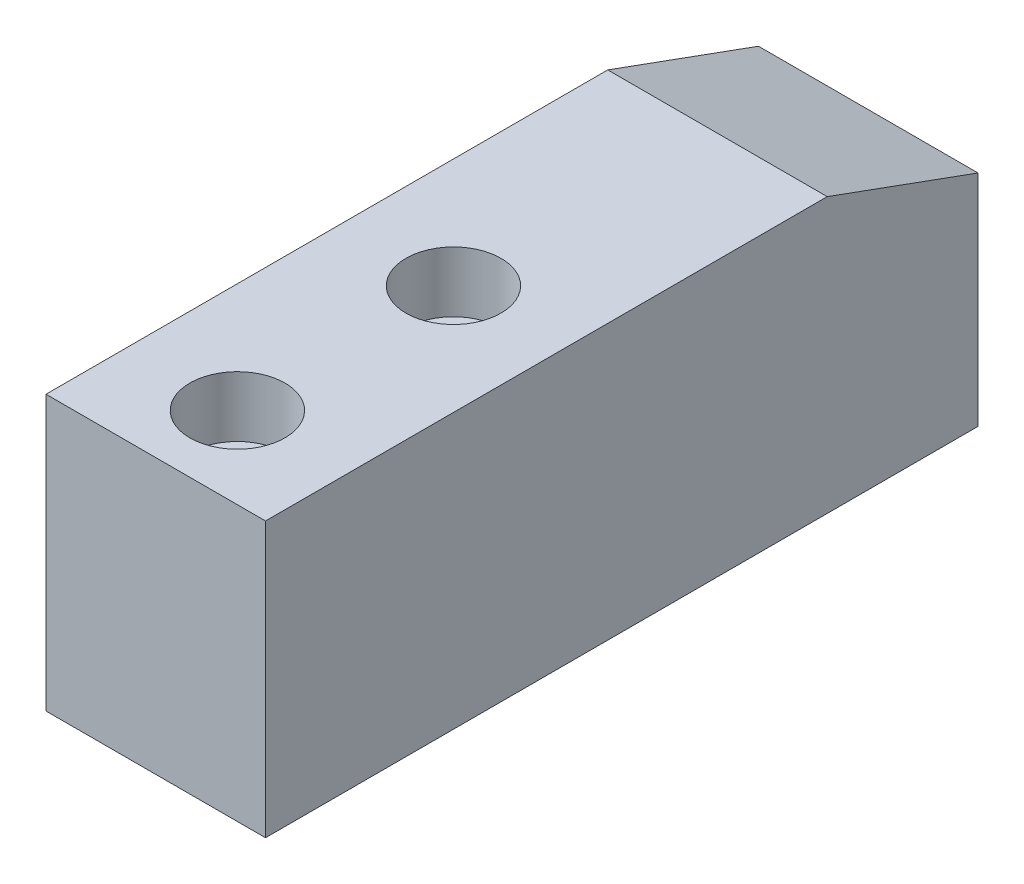
ISO-10303-21;
HEADER;
FILE_DESCRIPTION(('STEP AP214'),'2;1');
FILE_NAME('part.step','',(''),(''),'','','');
FILE_SCHEMA(('AUTOMOTIVE_DESIGN { 1 0 10303 214 1 1 1 1 }'));
ENDSEC;
DATA;
#1=APPLICATION_CONTEXT('core data for automotive mechanical design processes');
#2=APPLICATION_PROTOCOL_DEFINITION('international standard','automotive_design',2000,#1);
#3=PRODUCT_CONTEXT('',#1,'mechanical');
#4=PRODUCT('Part','Part','',(#3));
#5=PRODUCT_RELATED_PRODUCT_CATEGORY('part','',(#4));
#6=PRODUCT_DEFINITION_FORMATION('','',#4);
#7=PRODUCT_DEFINITION_CONTEXT('part definition',#1,'design');
#8=PRODUCT_DEFINITION('design','',#6,#7);
#9=PRODUCT_DEFINITION_SHAPE('','',#8);
#10=(LENGTH_UNIT() NAMED_UNIT(*) SI_UNIT(.MILLI.,.METRE.));
#11=(NAMED_UNIT(*) PLANE_ANGLE_UNIT() SI_UNIT($,.RADIAN.));
#12=(NAMED_UNIT(*) SI_UNIT($,.STERADIAN.) SOLID_ANGLE_UNIT());
#13=UNCERTAINTY_MEASURE_WITH_UNIT(LENGTH_MEASURE(1.E-05),#10,'distance_accuracy_value','');
#14=(GEOMETRIC_REPRESENTATION_CONTEXT(3) GLOBAL_UNCERTAINTY_ASSIGNED_CONTEXT((#13)) GLOBAL_UNIT_ASSIGNED_CONTEXT((#10,
#11,#12)) REPRESENTATION_CONTEXT('',''));
#15=CARTESIAN_POINT('',(0.,0.,0.));
#16=DIRECTION('',(0.,0.,1.));
#17=DIRECTION('',(1.,0.,0.));
#18=AXIS2_PLACEMENT_3D('',#15,#16,#17);
#19=CARTESIAN_POINT('',(12.7,31.75,0.));
#20=DIRECTION('',(0.,0.,-1.));
#21=DIRECTION('',(0.,1.,0.));
#22=AXIS2_PLACEMENT_3D('',#19,#20,#21);
#23=PLANE('',#22);
#24=DIRECTION('',(0.,-1.,0.));
#25=VECTOR('',#24,1.);
#26=CARTESIAN_POINT('',(-12.7,31.75,0.));
#27=LINE('',#26,#25);
#28=CARTESIAN_POINT('',(-12.7,31.75,0.));
#29=VERTEX_POINT('',#28);
#30=CARTESIAN_POINT('',(-12.7,0.,0.));
#31=VERTEX_POINT('',#30);
#32=EDGE_CURVE('E108',#29,#31,#27,.T.);
#33=ORIENTED_EDGE('',*,*,#32,.T.);
#34=DIRECTION('',(-1.,0.,0.));
#35=VECTOR('',#34,1.);
#36=CARTESIAN_POINT('',(12.7,0.,0.));
#37=LINE('',#36,#35);
#38=CARTESIAN_POINT('',(12.7,0.,0.));
#39=VERTEX_POINT('',#38);
#40=EDGE_CURVE('E11',#39,#31,#37,.T.);
#41=ORIENTED_EDGE('',*,*,#40,.F.);
#42=DIRECTION('',(0.,-1.,0.));
#43=VECTOR('',#42,1.);
#44=CARTESIAN_POINT('',(12.7,31.75,0.));
#45=LINE('',#44,#43);
#46=CARTESIAN_POINT('',(12.7,31.75,0.));
#47=VERTEX_POINT('',#46);
#48=EDGE_CURVE('E117',#47,#39,#45,.T.);
#49=ORIENTED_EDGE('',*,*,#48,.F.);
#50=DIRECTION('',(-1.,0.,0.));
#51=VECTOR('',#50,1.);
#52=CARTESIAN_POINT('',(12.7,31.75,0.));
#53=LINE('',#52,#51);
#54=EDGE_CURVE('E104',#47,#29,#53,.T.);
#55=ORIENTED_EDGE('',*,*,#54,.T.);
#56=EDGE_LOOP('',(#33,#41,#49,#55));
#57=FACE_BOUND('',#56,.T.);
#58=ADVANCED_FACE('F34',(#57),#23,.F.);
#59=CARTESIAN_POINT('',(12.7,0.,0.));
#60=DIRECTION('',(0.,1.,0.));
#61=DIRECTION('',(0.,0.,1.));
#62=AXIS2_PLACEMENT_3D('',#59,#60,#61);
#63=PLANE('',#62);
#64=CARTESIAN_POINT('',(0.,0.,-9.44648161353717));
#65=DIRECTION('',(0.,1.,0.));
#66=DIRECTION('',(0.,0.,1.));
#67=AXIS2_PLACEMENT_3D('',#64,#65,#66);
#68=CIRCLE('',#67,3.29999999999999);
#69=CARTESIAN_POINT('',(0.,0.,-6.14648161353717));
#70=VERTEX_POINT('',#69);
#71=EDGE_CURVE('E151',#70,#70,#68,.T.);
#72=ORIENTED_EDGE('',*,*,#71,.T.);
#73=EDGE_LOOP('',(#72));
#74=FACE_BOUND('',#73,.T.);
#75=CARTESIAN_POINT('',(0.,0.,-34.4464816135372));
#76=DIRECTION('',(0.,1.,0.));
#77=DIRECTION('',(0.,0.,1.));
#78=AXIS2_PLACEMENT_3D('',#75,#76,#77);
#79=CIRCLE('',#78,3.29999999999999);
#80=CARTESIAN_POINT('',(0.,0.,-31.1464816135372));
#81=VERTEX_POINT('',#80);
#82=EDGE_CURVE('E112',#81,#81,#79,.T.);
#83=ORIENTED_EDGE('',*,*,#82,.T.);
#84=EDGE_LOOP('',(#83));
#85=FACE_BOUND('',#84,.T.);
#86=DIRECTION('',(0.,0.,-1.));
#87=VECTOR('',#86,1.);
#88=CARTESIAN_POINT('',(-12.7,0.,0.));
#89=LINE('',#88,#87);
#90=CARTESIAN_POINT('',(-12.7,0.,-82.4464816135372));
#91=VERTEX_POINT('',#90);
#92=EDGE_CURVE('E111',#31,#91,#89,.T.);
#93=ORIENTED_EDGE('',*,*,#92,.T.);
#94=DIRECTION('',(-1.,0.,0.));
#95=VECTOR('',#94,1.);
#96=CARTESIAN_POINT('',(12.7,0.,-82.4464816135372));
#97=LINE('',#96,#95);
#98=CARTESIAN_POINT('',(12.7,0.,-82.4464816135372));
#99=VERTEX_POINT('',#98);
#100=EDGE_CURVE('E42',#99,#91,#97,.T.);
#101=ORIENTED_EDGE('',*,*,#100,.F.);
#102=DIRECTION('',(0.,0.,-1.));
#103=VECTOR('',#102,1.);
#104=CARTESIAN_POINT('',(12.7,0.,0.));
#105=LINE('',#104,#103);
#106=EDGE_CURVE('E84',#39,#99,#105,.T.);
#107=ORIENTED_EDGE('',*,*,#106,.F.);
#108=ORIENTED_EDGE('',*,*,#40,.T.);
#109=EDGE_LOOP('',(#93,#101,#107,#108));
#110=FACE_BOUND('',#109,.T.);
#111=ADVANCED_FACE('F139',(#74,#85,#110),#63,.F.);
#112=CARTESIAN_POINT('',(12.7,0.,-82.4464816135372));
#113=DIRECTION('',(0.,0.,1.));
#114=DIRECTION('',(0.,-1.,0.));
#115=AXIS2_PLACEMENT_3D('',#112,#113,#114);
#116=PLANE('',#115);
#117=DIRECTION('',(0.,1.,0.));
#118=VECTOR('',#117,1.);
#119=CARTESIAN_POINT('',(-12.7,0.,-82.4464816135372));
#120=LINE('',#119,#118);
#121=CARTESIAN_POINT('',(-12.7,25.4,-82.4464816135372));
#122=VERTEX_POINT('',#121);
#123=EDGE_CURVE('E99',#91,#122,#120,.T.);
#124=ORIENTED_EDGE('',*,*,#123,.T.);
#125=DIRECTION('',(-1.,0.,0.));
#126=VECTOR('',#125,1.);
#127=CARTESIAN_POINT('',(12.7,25.4,-82.4464816135372));
#128=LINE('',#127,#126);
#129=CARTESIAN_POINT('',(12.7,25.4,-82.4464816135372));
#130=VERTEX_POINT('',#129);
#131=EDGE_CURVE('E96',#130,#122,#128,.T.);
#132=ORIENTED_EDGE('',*,*,#131,.F.);
#133=DIRECTION('',(0.,1.,0.));
#134=VECTOR('',#133,1.);
#135=CARTESIAN_POINT('',(12.7,0.,-82.4464816135372));
#136=LINE('',#135,#134);
#137=EDGE_CURVE('E88',#99,#130,#136,.T.);
#138=ORIENTED_EDGE('',*,*,#137,.F.);
#139=ORIENTED_EDGE('',*,*,#100,.T.);
#140=EDGE_LOOP('',(#124,#132,#138,#139));
#141=FACE_BOUND('',#140,.T.);
#142=ADVANCED_FACE('F97',(#141),#116,.F.);
#143=CARTESIAN_POINT('',(12.7,25.4,-82.4464816135372));
#144=DIRECTION('',(0.,-0.93969262078591,0.342020143325663));
#145=DIRECTION('',(0.,-0.342020143325663,-0.939692620785911));
#146=AXIS2_PLACEMENT_3D('',#143,#144,#145);
#147=PLANE('',#146);
#148=DIRECTION('',(0.,0.342020143325663,0.93969262078591));
#149=VECTOR('',#148,1.);
#150=CARTESIAN_POINT('',(-12.7,25.4,-82.4464816135372));
#151=LINE('',#150,#149);
#152=CARTESIAN_POINT('',(-12.7,31.75,-65.));
#153=VERTEX_POINT('',#152);
#154=EDGE_CURVE('E70',#122,#153,#151,.T.);
#155=ORIENTED_EDGE('',*,*,#154,.T.);
#156=DIRECTION('',(-1.,0.,0.));
#157=VECTOR('',#156,1.);
#158=CARTESIAN_POINT('',(12.7,31.75,-65.));
#159=LINE('',#158,#157);
#160=CARTESIAN_POINT('',(12.7,31.75,-65.));
#161=VERTEX_POINT('',#160);
#162=EDGE_CURVE('E100',#161,#153,#159,.T.);
#163=ORIENTED_EDGE('',*,*,#162,.F.);
#164=DIRECTION('',(0.,0.342020143325663,0.93969262078591));
#165=VECTOR('',#164,1.);
#166=CARTESIAN_POINT('',(12.7,25.4,-82.4464816135372));
#167=LINE('',#166,#165);
#168=EDGE_CURVE('E92',#130,#161,#167,.T.);
#169=ORIENTED_EDGE('',*,*,#168,.F.);
#170=ORIENTED_EDGE('',*,*,#131,.T.);
#171=EDGE_LOOP('',(#155,#163,#169,#170));
#172=FACE_BOUND('',#171,.T.);
#173=ADVANCED_FACE('F102',(#172),#147,.F.);
#174=CARTESIAN_POINT('',(12.7,31.75,-65.));
#175=DIRECTION('',(0.,-1.,0.));
#176=DIRECTION('',(0.,0.,-1.));
#177=AXIS2_PLACEMENT_3D('',#174,#175,#176);
#178=PLANE('',#177);
#179=CARTESIAN_POINT('',(0.,31.75,-9.44648161353716));
#180=DIRECTION('',(0.,1.,0.));
#181=DIRECTION('',(0.,0.,1.));
#182=AXIS2_PLACEMENT_3D('',#179,#180,#181);
#183=CIRCLE('',#182,5.5);
#184=CARTESIAN_POINT('',(0.,31.75,-3.94648161353716));
#185=VERTEX_POINT('',#184);
#186=EDGE_CURVE('E174',#185,#185,#183,.T.);
#187=ORIENTED_EDGE('',*,*,#186,.F.);
#188=EDGE_LOOP('',(#187));
#189=FACE_BOUND('',#188,.T.);
#190=CARTESIAN_POINT('',(0.,31.75,-34.4464816135372));
#191=DIRECTION('',(0.,1.,0.));
#192=DIRECTION('',(0.,0.,1.));
#193=AXIS2_PLACEMENT_3D('',#190,#191,#192);
#194=CIRCLE('',#193,5.5);
#195=CARTESIAN_POINT('',(0.,31.75,-28.9464816135372));
#196=VERTEX_POINT('',#195);
#197=EDGE_CURVE('E164',#196,#196,#194,.T.);
#198=ORIENTED_EDGE('',*,*,#197,.F.);
#199=EDGE_LOOP('',(#198));
#200=FACE_BOUND('',#199,.T.);
#201=DIRECTION('',(0.,0.,1.));
#202=VECTOR('',#201,1.);
#203=CARTESIAN_POINT('',(-12.7,31.75,-65.));
#204=LINE('',#203,#202);
#205=EDGE_CURVE('E76',#153,#29,#204,.T.);
#206=ORIENTED_EDGE('',*,*,#205,.T.);
#207=ORIENTED_EDGE('',*,*,#54,.F.);
#208=DIRECTION('',(0.,0.,1.));
#209=VECTOR('',#208,1.);
#210=CARTESIAN_POINT('',(12.7,31.75,-65.));
#211=LINE('',#210,#209);
#212=EDGE_CURVE('E50',#161,#47,#211,.T.);
#213=ORIENTED_EDGE('',*,*,#212,.F.);
#214=ORIENTED_EDGE('',*,*,#162,.T.);
#215=EDGE_LOOP('',(#206,#207,#213,#214));
#216=FACE_BOUND('',#215,.T.);
#217=ADVANCED_FACE('F125',(#189,#200,#216),#178,.F.);
#218=CARTESIAN_POINT('',(12.7,0.,0.));
#219=DIRECTION('',(1.,0.,0.));
#220=DIRECTION('',(0.,0.,-1.));
#221=AXIS2_PLACEMENT_3D('',#218,#219,#220);
#222=PLANE('',#221);
#223=ORIENTED_EDGE('',*,*,#48,.T.);
#224=ORIENTED_EDGE('',*,*,#106,.T.);
#225=ORIENTED_EDGE('',*,*,#137,.T.);
#226=ORIENTED_EDGE('',*,*,#168,.T.);
#227=ORIENTED_EDGE('',*,*,#212,.T.);
#228=EDGE_LOOP('',(#223,#224,#225,#226,#227));
#229=FACE_BOUND('',#228,.T.);
#230=ADVANCED_FACE('F90',(#229),#222,.T.);
#231=CARTESIAN_POINT('',(-12.7,0.,0.));
#232=DIRECTION('',(1.,0.,0.));
#233=DIRECTION('',(0.,0.,-1.));
#234=AXIS2_PLACEMENT_3D('',#231,#232,#233);
#235=PLANE('',#234);
#236=ORIENTED_EDGE('',*,*,#32,.F.);
#237=ORIENTED_EDGE('',*,*,#205,.F.);
#238=ORIENTED_EDGE('',*,*,#154,.F.);
#239=ORIENTED_EDGE('',*,*,#123,.F.);
#240=ORIENTED_EDGE('',*,*,#92,.F.);
#241=EDGE_LOOP('',(#236,#237,#238,#239,#240));
#242=FACE_BOUND('',#241,.T.);
#243=ADVANCED_FACE('F121',(#242),#235,.F.);
#244=CARTESIAN_POINT('',(0.,31.75,-34.4464816135372));
#245=DIRECTION('',(0.,1.,0.));
#246=DIRECTION('',(0.,0.,1.));
#247=AXIS2_PLACEMENT_3D('',#244,#245,#246);
#248=CYLINDRICAL_SURFACE('',#247,3.3);
#249=ORIENTED_EDGE('',*,*,#82,.F.);
#250=EDGE_LOOP('',(#249));
#251=FACE_BOUND('',#250,.T.);
#252=CARTESIAN_POINT('',(0.,24.75,-34.4464816135372));
#253=DIRECTION('',(0.,1.,0.));
#254=DIRECTION('',(0.,0.,1.));
#255=AXIS2_PLACEMENT_3D('',#252,#253,#254);
#256=CIRCLE('',#255,3.3);
#257=CARTESIAN_POINT('',(0.,24.75,-31.1464816135372));
#258=VERTEX_POINT('',#257);
#259=EDGE_CURVE('E155',#258,#258,#256,.T.);
#260=ORIENTED_EDGE('',*,*,#259,.T.);
#261=EDGE_LOOP('',(#260));
#262=FACE_BOUND('',#261,.T.);
#263=ADVANCED_FACE('F200',(#251,#262),#248,.F.);
#264=CARTESIAN_POINT('',(3.3,24.75,-34.4464816135372));
#265=DIRECTION('',(0.,-1.,0.));
#266=DIRECTION('',(0.,0.,-1.));
#267=AXIS2_PLACEMENT_3D('',#264,#265,#266);
#268=PLANE('',#267);
#269=ORIENTED_EDGE('',*,*,#259,.F.);
#270=EDGE_LOOP('',(#269));
#271=FACE_BOUND('',#270,.T.);
#272=CARTESIAN_POINT('',(0.,24.75,-34.4464816135372));
#273=DIRECTION('',(0.,1.,0.));
#274=DIRECTION('',(0.,0.,1.));
#275=AXIS2_PLACEMENT_3D('',#272,#273,#274);
#276=CIRCLE('',#275,5.5);
#277=CARTESIAN_POINT('',(0.,24.75,-28.9464816135372));
#278=VERTEX_POINT('',#277);
#279=EDGE_CURVE('E158',#278,#278,#276,.T.);
#280=ORIENTED_EDGE('',*,*,#279,.T.);
#281=EDGE_LOOP('',(#280));
#282=FACE_BOUND('',#281,.T.);
#283=ADVANCED_FACE('F196',(#271,#282),#268,.F.);
#284=CARTESIAN_POINT('',(0.,31.75,-34.4464816135372));
#285=DIRECTION('',(0.,1.,0.));
#286=DIRECTION('',(0.,0.,1.));
#287=AXIS2_PLACEMENT_3D('',#284,#285,#286);
#288=CYLINDRICAL_SURFACE('',#287,5.5);
#289=ORIENTED_EDGE('',*,*,#279,.F.);
#290=EDGE_LOOP('',(#289));
#291=FACE_BOUND('',#290,.T.);
#292=ORIENTED_EDGE('',*,*,#197,.T.);
#293=EDGE_LOOP('',(#292));
#294=FACE_BOUND('',#293,.T.);
#295=ADVANCED_FACE('F192',(#291,#294),#288,.F.);
#296=CARTESIAN_POINT('',(0.,31.75,-9.44648161353716));
#297=DIRECTION('',(0.,1.,0.));
#298=DIRECTION('',(0.,0.,1.));
#299=AXIS2_PLACEMENT_3D('',#296,#297,#298);
#300=CYLINDRICAL_SURFACE('',#299,3.3);
#301=ORIENTED_EDGE('',*,*,#71,.F.);
#302=EDGE_LOOP('',(#301));
#303=FACE_BOUND('',#302,.T.);
#304=CARTESIAN_POINT('',(0.,24.75,-9.44648161353716));
#305=DIRECTION('',(0.,1.,0.));
#306=DIRECTION('',(0.,0.,1.));
#307=AXIS2_PLACEMENT_3D('',#304,#305,#306);
#308=CIRCLE('',#307,3.3);
#309=CARTESIAN_POINT('',(0.,24.75,-6.14648161353716));
#310=VERTEX_POINT('',#309);
#311=EDGE_CURVE('E168',#310,#310,#308,.T.);
#312=ORIENTED_EDGE('',*,*,#311,.T.);
#313=EDGE_LOOP('',(#312));
#314=FACE_BOUND('',#313,.T.);
#315=ADVANCED_FACE('F185',(#303,#314),#300,.F.);
#316=CARTESIAN_POINT('',(3.3,24.75,-9.44648161353716));
#317=DIRECTION('',(0.,-1.,0.));
#318=DIRECTION('',(0.,0.,-1.));
#319=AXIS2_PLACEMENT_3D('',#316,#317,#318);
#320=PLANE('',#319);
#321=ORIENTED_EDGE('',*,*,#311,.F.);
#322=EDGE_LOOP('',(#321));
#323=FACE_BOUND('',#322,.T.);
#324=CARTESIAN_POINT('',(0.,24.75,-9.44648161353716));
#325=DIRECTION('',(0.,1.,0.));
#326=DIRECTION('',(0.,0.,1.));
#327=AXIS2_PLACEMENT_3D('',#324,#325,#326);
#328=CIRCLE('',#327,5.5);
#329=CARTESIAN_POINT('',(0.,24.75,-3.94648161353717));
#330=VERTEX_POINT('',#329);
#331=EDGE_CURVE('E171',#330,#330,#328,.T.);
#332=ORIENTED_EDGE('',*,*,#331,.T.);
#333=EDGE_LOOP('',(#332));
#334=FACE_BOUND('',#333,.T.);
#335=ADVANCED_FACE('F179',(#323,#334),#320,.F.);
#336=CARTESIAN_POINT('',(0.,31.75,-9.44648161353716));
#337=DIRECTION('',(0.,1.,0.));
#338=DIRECTION('',(0.,0.,1.));
#339=AXIS2_PLACEMENT_3D('',#336,#337,#338);
#340=CYLINDRICAL_SURFACE('',#339,5.5);
#341=ORIENTED_EDGE('',*,*,#331,.F.);
#342=EDGE_LOOP('',(#341));
#343=FACE_BOUND('',#342,.T.);
#344=ORIENTED_EDGE('',*,*,#186,.T.);
#345=EDGE_LOOP('',(#344));
#346=FACE_BOUND('',#345,.T.);
#347=ADVANCED_FACE('F177',(#343,#346),#340,.F.);
#348=CLOSED_SHELL('',(#58,#111,#142,#173,#217,#230,#243,#263,#283,#295,#315,#335,#347));
#349=MANIFOLD_SOLID_BREP('B2',#348);
#350=ADVANCED_BREP_SHAPE_REPRESENTATION('',(#18,#349),#14);
#351=SHAPE_DEFINITION_REPRESENTATION(#9,#350);
ENDSEC;
END-ISO-10303-21;
